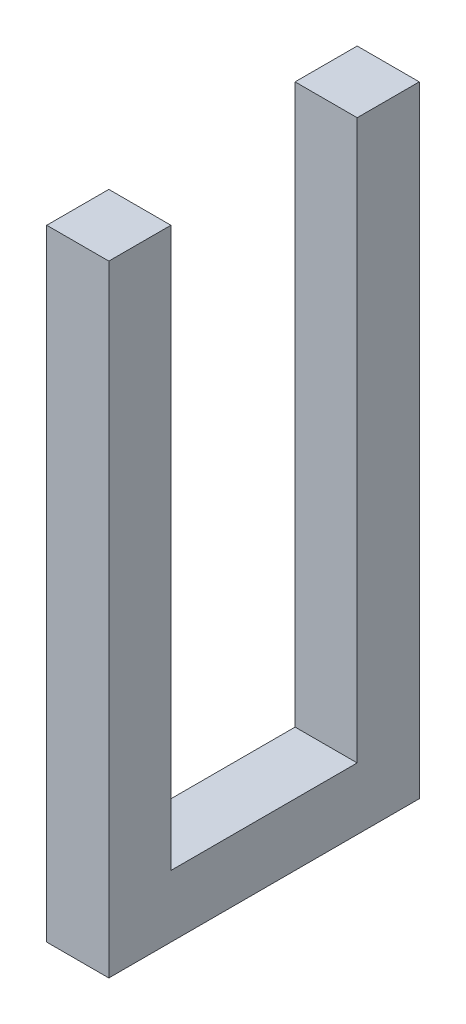
ISO-10303-21;
HEADER;
FILE_DESCRIPTION(('STEP AP214'),'2;1');
FILE_NAME('part.step','',(''),(''),'','','');
FILE_SCHEMA(('AUTOMOTIVE_DESIGN { 1 0 10303 214 1 1 1 1 }'));
ENDSEC;
DATA;
#1=APPLICATION_CONTEXT('core data for automotive mechanical design processes');
#2=APPLICATION_PROTOCOL_DEFINITION('international standard','automotive_design',2000,#1);
#3=PRODUCT_CONTEXT('',#1,'mechanical');
#4=PRODUCT('Part','Part','',(#3));
#5=PRODUCT_RELATED_PRODUCT_CATEGORY('part','',(#4));
#6=PRODUCT_DEFINITION_FORMATION('','',#4);
#7=PRODUCT_DEFINITION_CONTEXT('part definition',#1,'design');
#8=PRODUCT_DEFINITION('design','',#6,#7);
#9=PRODUCT_DEFINITION_SHAPE('','',#8);
#10=(LENGTH_UNIT() NAMED_UNIT(*) SI_UNIT(.MILLI.,.METRE.));
#11=(NAMED_UNIT(*) PLANE_ANGLE_UNIT() SI_UNIT($,.RADIAN.));
#12=(NAMED_UNIT(*) SI_UNIT($,.STERADIAN.) SOLID_ANGLE_UNIT());
#13=UNCERTAINTY_MEASURE_WITH_UNIT(LENGTH_MEASURE(1.E-05),#10,'distance_accuracy_value','');
#14=(GEOMETRIC_REPRESENTATION_CONTEXT(3) GLOBAL_UNCERTAINTY_ASSIGNED_CONTEXT((#13)) GLOBAL_UNIT_ASSIGNED_CONTEXT((#10,
#11,#12)) REPRESENTATION_CONTEXT('',''));
#15=CARTESIAN_POINT('',(0.,0.,0.));
#16=DIRECTION('',(0.,0.,1.));
#17=DIRECTION('',(1.,0.,0.));
#18=AXIS2_PLACEMENT_3D('',#15,#16,#17);
#19=CARTESIAN_POINT('',(10.,0.,-50.));
#20=DIRECTION('',(0.,1.,0.));
#21=DIRECTION('',(0.,0.,1.));
#22=AXIS2_PLACEMENT_3D('',#19,#20,#21);
#23=PLANE('',#22);
#24=DIRECTION('',(0.,0.,-1.));
#25=VECTOR('',#24,1.);
#26=CARTESIAN_POINT('',(0.,0.,-50.));
#27=LINE('',#26,#25);
#28=CARTESIAN_POINT('',(0.,0.,0.));
#29=VERTEX_POINT('',#28);
#30=CARTESIAN_POINT('',(0.,0.,-50.));
#31=VERTEX_POINT('',#30);
#32=EDGE_CURVE('E129',#29,#31,#27,.T.);
#33=ORIENTED_EDGE('',*,*,#32,.T.);
#34=DIRECTION('',(-1.,0.,0.));
#35=VECTOR('',#34,1.);
#36=CARTESIAN_POINT('',(10.,0.,-50.));
#37=LINE('',#36,#35);
#38=CARTESIAN_POINT('',(10.,0.,-50.));
#39=VERTEX_POINT('',#38);
#40=EDGE_CURVE('E11',#39,#31,#37,.T.);
#41=ORIENTED_EDGE('',*,*,#40,.F.);
#42=DIRECTION('',(0.,0.,-1.));
#43=VECTOR('',#42,1.);
#44=CARTESIAN_POINT('',(10.,0.,-50.));
#45=LINE('',#44,#43);
#46=CARTESIAN_POINT('',(10.,0.,0.));
#47=VERTEX_POINT('',#46);
#48=EDGE_CURVE('E143',#47,#39,#45,.T.);
#49=ORIENTED_EDGE('',*,*,#48,.F.);
#50=DIRECTION('',(-1.,0.,0.));
#51=VECTOR('',#50,1.);
#52=CARTESIAN_POINT('',(10.,0.,0.));
#53=LINE('',#52,#51);
#54=EDGE_CURVE('E125',#47,#29,#53,.T.);
#55=ORIENTED_EDGE('',*,*,#54,.T.);
#56=EDGE_LOOP('',(#33,#41,#49,#55));
#57=FACE_BOUND('',#56,.T.);
#58=ADVANCED_FACE('F33',(#57),#23,.F.);
#59=CARTESIAN_POINT('',(10.,100.,-50.));
#60=DIRECTION('',(0.,0.,1.));
#61=DIRECTION('',(0.,-1.,0.));
#62=AXIS2_PLACEMENT_3D('',#59,#60,#61);
#63=PLANE('',#62);
#64=DIRECTION('',(0.,1.,0.));
#65=VECTOR('',#64,1.);
#66=CARTESIAN_POINT('',(0.,100.,-50.));
#67=LINE('',#66,#65);
#68=CARTESIAN_POINT('',(0.,100.,-50.));
#69=VERTEX_POINT('',#68);
#70=EDGE_CURVE('E132',#31,#69,#67,.T.);
#71=ORIENTED_EDGE('',*,*,#70,.T.);
#72=DIRECTION('',(-1.,0.,0.));
#73=VECTOR('',#72,1.);
#74=CARTESIAN_POINT('',(10.,100.,-50.));
#75=LINE('',#74,#73);
#76=CARTESIAN_POINT('',(10.,100.,-50.));
#77=VERTEX_POINT('',#76);
#78=EDGE_CURVE('E41',#77,#69,#75,.T.);
#79=ORIENTED_EDGE('',*,*,#78,.F.);
#80=DIRECTION('',(0.,1.,0.));
#81=VECTOR('',#80,1.);
#82=CARTESIAN_POINT('',(10.,100.,-50.));
#83=LINE('',#82,#81);
#84=EDGE_CURVE('E92',#39,#77,#83,.T.);
#85=ORIENTED_EDGE('',*,*,#84,.F.);
#86=ORIENTED_EDGE('',*,*,#40,.T.);
#87=EDGE_LOOP('',(#71,#79,#85,#86));
#88=FACE_BOUND('',#87,.T.);
#89=ADVANCED_FACE('F178',(#88),#63,.F.);
#90=CARTESIAN_POINT('',(10.,100.,-40.));
#91=DIRECTION('',(0.,-1.,0.));
#92=DIRECTION('',(0.,0.,-1.));
#93=AXIS2_PLACEMENT_3D('',#90,#91,#92);
#94=PLANE('',#93);
#95=DIRECTION('',(0.,0.,1.));
#96=VECTOR('',#95,1.);
#97=CARTESIAN_POINT('',(0.,100.,-40.));
#98=LINE('',#97,#96);
#99=CARTESIAN_POINT('',(0.,100.,-40.));
#100=VERTEX_POINT('',#99);
#101=EDGE_CURVE('E134',#69,#100,#98,.T.);
#102=ORIENTED_EDGE('',*,*,#101,.T.);
#103=DIRECTION('',(-1.,0.,0.));
#104=VECTOR('',#103,1.);
#105=CARTESIAN_POINT('',(10.,100.,-40.));
#106=LINE('',#105,#104);
#107=CARTESIAN_POINT('',(10.,100.,-40.));
#108=VERTEX_POINT('',#107);
#109=EDGE_CURVE('E150',#108,#100,#106,.T.);
#110=ORIENTED_EDGE('',*,*,#109,.F.);
#111=DIRECTION('',(0.,0.,1.));
#112=VECTOR('',#111,1.);
#113=CARTESIAN_POINT('',(10.,100.,-40.));
#114=LINE('',#113,#112);
#115=EDGE_CURVE('E158',#77,#108,#114,.T.);
#116=ORIENTED_EDGE('',*,*,#115,.F.);
#117=ORIENTED_EDGE('',*,*,#78,.T.);
#118=EDGE_LOOP('',(#102,#110,#116,#117));
#119=FACE_BOUND('',#118,.T.);
#120=ADVANCED_FACE('F156',(#119),#94,.F.);
#121=CARTESIAN_POINT('',(10.,9.99999999999999,-40.));
#122=DIRECTION('',(0.,0.,-1.));
#123=DIRECTION('',(-1.,0.,0.));
#124=AXIS2_PLACEMENT_3D('',#121,#122,#123);
#125=PLANE('',#124);
#126=DIRECTION('',(0.,-1.,0.));
#127=VECTOR('',#126,1.);
#128=CARTESIAN_POINT('',(0.,9.99999999999999,-40.));
#129=LINE('',#128,#127);
#130=CARTESIAN_POINT('',(0.,9.99999999999999,-40.));
#131=VERTEX_POINT('',#130);
#132=EDGE_CURVE('E136',#100,#131,#129,.T.);
#133=ORIENTED_EDGE('',*,*,#132,.T.);
#134=DIRECTION('',(-1.,0.,0.));
#135=VECTOR('',#134,1.);
#136=CARTESIAN_POINT('',(10.,9.99999999999999,-40.));
#137=LINE('',#136,#135);
#138=CARTESIAN_POINT('',(10.,9.99999999999999,-40.));
#139=VERTEX_POINT('',#138);
#140=EDGE_CURVE('E147',#139,#131,#137,.T.);
#141=ORIENTED_EDGE('',*,*,#140,.F.);
#142=DIRECTION('',(0.,-1.,0.));
#143=VECTOR('',#142,1.);
#144=CARTESIAN_POINT('',(10.,9.99999999999999,-40.));
#145=LINE('',#144,#143);
#146=EDGE_CURVE('E170',#108,#139,#145,.T.);
#147=ORIENTED_EDGE('',*,*,#146,.F.);
#148=ORIENTED_EDGE('',*,*,#109,.T.);
#149=EDGE_LOOP('',(#133,#141,#147,#148));
#150=FACE_BOUND('',#149,.T.);
#151=ADVANCED_FACE('F166',(#150),#125,.F.);
#152=CARTESIAN_POINT('',(10.,9.99999999999999,-10.));
#153=DIRECTION('',(0.,-1.,0.));
#154=DIRECTION('',(0.,0.,-1.));
#155=AXIS2_PLACEMENT_3D('',#152,#153,#154);
#156=PLANE('',#155);
#157=DIRECTION('',(0.,0.,1.));
#158=VECTOR('',#157,1.);
#159=CARTESIAN_POINT('',(0.,9.99999999999999,-10.));
#160=LINE('',#159,#158);
#161=CARTESIAN_POINT('',(0.,9.99999999999999,-10.));
#162=VERTEX_POINT('',#161);
#163=EDGE_CURVE('E138',#131,#162,#160,.T.);
#164=ORIENTED_EDGE('',*,*,#163,.T.);
#165=DIRECTION('',(-1.,0.,0.));
#166=VECTOR('',#165,1.);
#167=CARTESIAN_POINT('',(10.,9.99999999999999,-10.));
#168=LINE('',#167,#166);
#169=CARTESIAN_POINT('',(10.,9.99999999999999,-10.));
#170=VERTEX_POINT('',#169);
#171=EDGE_CURVE('E120',#170,#162,#168,.T.);
#172=ORIENTED_EDGE('',*,*,#171,.F.);
#173=DIRECTION('',(0.,0.,1.));
#174=VECTOR('',#173,1.);
#175=CARTESIAN_POINT('',(10.,9.99999999999999,-10.));
#176=LINE('',#175,#174);
#177=EDGE_CURVE('E111',#139,#170,#176,.T.);
#178=ORIENTED_EDGE('',*,*,#177,.F.);
#179=ORIENTED_EDGE('',*,*,#140,.T.);
#180=EDGE_LOOP('',(#164,#172,#178,#179));
#181=FACE_BOUND('',#180,.T.);
#182=ADVANCED_FACE('F169',(#181),#156,.F.);
#183=CARTESIAN_POINT('',(10.,100.,-9.99999999999999));
#184=DIRECTION('',(0.,0.,1.));
#185=DIRECTION('',(0.,-1.,0.));
#186=AXIS2_PLACEMENT_3D('',#183,#184,#185);
#187=PLANE('',#186);
#188=DIRECTION('',(0.,1.,0.));
#189=VECTOR('',#188,1.);
#190=CARTESIAN_POINT('',(0.,100.,-9.99999999999999));
#191=LINE('',#190,#189);
#192=CARTESIAN_POINT('',(0.,100.,-9.99999999999999));
#193=VERTEX_POINT('',#192);
#194=EDGE_CURVE('E119',#162,#193,#191,.T.);
#195=ORIENTED_EDGE('',*,*,#194,.T.);
#196=DIRECTION('',(-1.,0.,0.));
#197=VECTOR('',#196,1.);
#198=CARTESIAN_POINT('',(10.,100.,-9.99999999999999));
#199=LINE('',#198,#197);
#200=CARTESIAN_POINT('',(10.,100.,-9.99999999999999));
#201=VERTEX_POINT('',#200);
#202=EDGE_CURVE('E116',#201,#193,#199,.T.);
#203=ORIENTED_EDGE('',*,*,#202,.F.);
#204=DIRECTION('',(0.,1.,0.));
#205=VECTOR('',#204,1.);
#206=CARTESIAN_POINT('',(10.,100.,-9.99999999999999));
#207=LINE('',#206,#205);
#208=EDGE_CURVE('E105',#170,#201,#207,.T.);
#209=ORIENTED_EDGE('',*,*,#208,.F.);
#210=ORIENTED_EDGE('',*,*,#171,.T.);
#211=EDGE_LOOP('',(#195,#203,#209,#210));
#212=FACE_BOUND('',#211,.T.);
#213=ADVANCED_FACE('F117',(#212),#187,.F.);
#214=CARTESIAN_POINT('',(10.,100.,0.));
#215=DIRECTION('',(0.,-1.,0.));
#216=DIRECTION('',(0.,0.,-1.));
#217=AXIS2_PLACEMENT_3D('',#214,#215,#216);
#218=PLANE('',#217);
#219=DIRECTION('',(0.,0.,1.));
#220=VECTOR('',#219,1.);
#221=CARTESIAN_POINT('',(0.,100.,0.));
#222=LINE('',#221,#220);
#223=CARTESIAN_POINT('',(0.,100.,0.));
#224=VERTEX_POINT('',#223);
#225=EDGE_CURVE('E78',#193,#224,#222,.T.);
#226=ORIENTED_EDGE('',*,*,#225,.T.);
#227=DIRECTION('',(-1.,0.,0.));
#228=VECTOR('',#227,1.);
#229=CARTESIAN_POINT('',(10.,100.,0.));
#230=LINE('',#229,#228);
#231=CARTESIAN_POINT('',(10.,100.,0.));
#232=VERTEX_POINT('',#231);
#233=EDGE_CURVE('E121',#232,#224,#230,.T.);
#234=ORIENTED_EDGE('',*,*,#233,.F.);
#235=DIRECTION('',(0.,0.,1.));
#236=VECTOR('',#235,1.);
#237=CARTESIAN_POINT('',(10.,100.,0.));
#238=LINE('',#237,#236);
#239=EDGE_CURVE('E109',#201,#232,#238,.T.);
#240=ORIENTED_EDGE('',*,*,#239,.F.);
#241=ORIENTED_EDGE('',*,*,#202,.T.);
#242=EDGE_LOOP('',(#226,#234,#240,#241));
#243=FACE_BOUND('',#242,.T.);
#244=ADVANCED_FACE('F123',(#243),#218,.F.);
#245=CARTESIAN_POINT('',(10.,0.,0.));
#246=DIRECTION('',(0.,0.,-1.));
#247=DIRECTION('',(-1.,0.,0.));
#248=AXIS2_PLACEMENT_3D('',#245,#246,#247);
#249=PLANE('',#248);
#250=DIRECTION('',(0.,-1.,0.));
#251=VECTOR('',#250,1.);
#252=CARTESIAN_POINT('',(0.,0.,0.));
#253=LINE('',#252,#251);
#254=EDGE_CURVE('E84',#224,#29,#253,.T.);
#255=ORIENTED_EDGE('',*,*,#254,.T.);
#256=ORIENTED_EDGE('',*,*,#54,.F.);
#257=DIRECTION('',(0.,-1.,0.));
#258=VECTOR('',#257,1.);
#259=CARTESIAN_POINT('',(10.,0.,0.));
#260=LINE('',#259,#258);
#261=EDGE_CURVE('E49',#232,#47,#260,.T.);
#262=ORIENTED_EDGE('',*,*,#261,.F.);
#263=ORIENTED_EDGE('',*,*,#233,.T.);
#264=EDGE_LOOP('',(#255,#256,#262,#263));
#265=FACE_BOUND('',#264,.T.);
#266=ADVANCED_FACE('F194',(#265),#249,.F.);
#267=CARTESIAN_POINT('',(10.,0.,0.));
#268=DIRECTION('',(-1.,0.,0.));
#269=DIRECTION('',(0.,0.,1.));
#270=AXIS2_PLACEMENT_3D('',#267,#268,#269);
#271=PLANE('',#270);
#272=ORIENTED_EDGE('',*,*,#48,.T.);
#273=ORIENTED_EDGE('',*,*,#84,.T.);
#274=ORIENTED_EDGE('',*,*,#115,.T.);
#275=ORIENTED_EDGE('',*,*,#146,.T.);
#276=ORIENTED_EDGE('',*,*,#177,.T.);
#277=ORIENTED_EDGE('',*,*,#208,.T.);
#278=ORIENTED_EDGE('',*,*,#239,.T.);
#279=ORIENTED_EDGE('',*,*,#261,.T.);
#280=EDGE_LOOP('',(#272,#273,#274,#275,#276,#277,#278,#279));
#281=FACE_BOUND('',#280,.T.);
#282=ADVANCED_FACE('F107',(#281),#271,.F.);
#283=CARTESIAN_POINT('',(0.,0.,0.));
#284=DIRECTION('',(-1.,0.,0.));
#285=DIRECTION('',(0.,0.,1.));
#286=AXIS2_PLACEMENT_3D('',#283,#284,#285);
#287=PLANE('',#286);
#288=ORIENTED_EDGE('',*,*,#32,.F.);
#289=ORIENTED_EDGE('',*,*,#254,.F.);
#290=ORIENTED_EDGE('',*,*,#225,.F.);
#291=ORIENTED_EDGE('',*,*,#194,.F.);
#292=ORIENTED_EDGE('',*,*,#163,.F.);
#293=ORIENTED_EDGE('',*,*,#132,.F.);
#294=ORIENTED_EDGE('',*,*,#101,.F.);
#295=ORIENTED_EDGE('',*,*,#70,.F.);
#296=EDGE_LOOP('',(#288,#289,#290,#291,#292,#293,#294,#295));
#297=FACE_BOUND('',#296,.T.);
#298=ADVANCED_FACE('F162',(#297),#287,.T.);
#299=CLOSED_SHELL('',(#58,#89,#120,#151,#182,#213,#244,#266,#282,#298));
#300=MANIFOLD_SOLID_BREP('B2',#299);
#301=ADVANCED_BREP_SHAPE_REPRESENTATION('',(#18,#300),#14);
#302=SHAPE_DEFINITION_REPRESENTATION(#9,#301);
ENDSEC;
END-ISO-10303-21;
